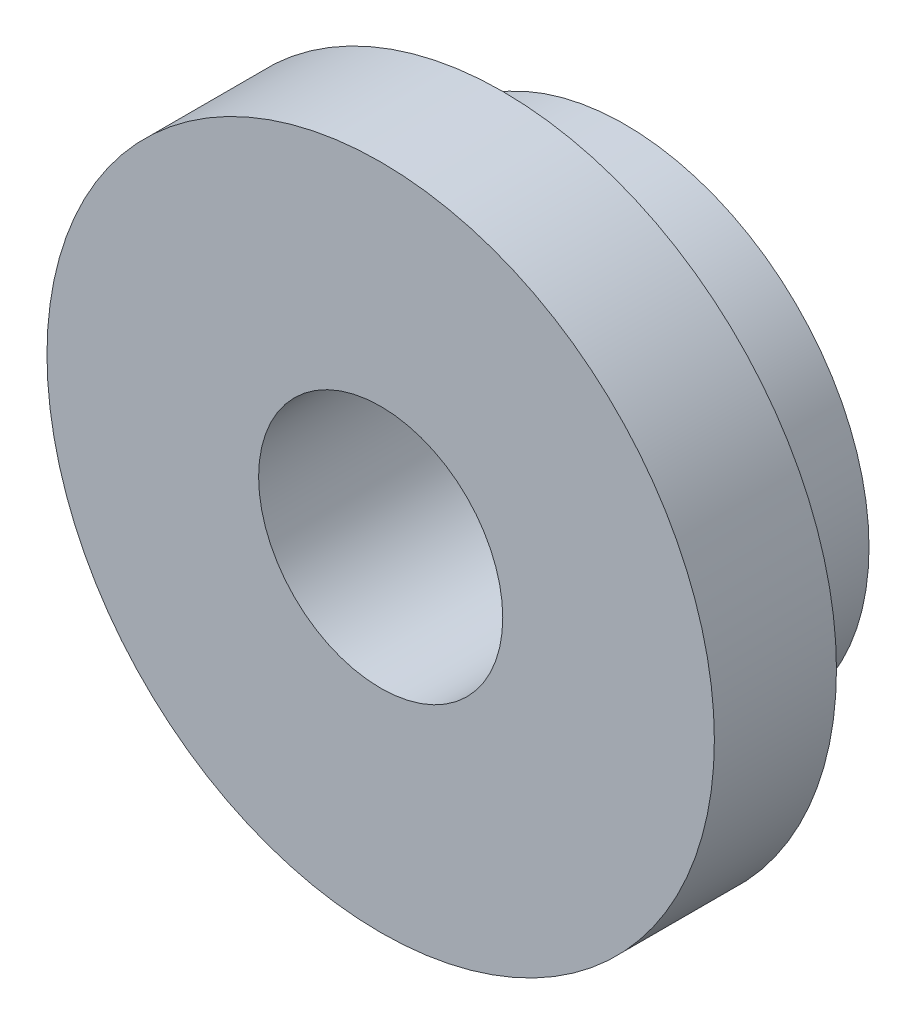
ISO-10303-21;
HEADER;
FILE_DESCRIPTION(('STEP AP214'),'2;1');
FILE_NAME('part.step','',(''),(''),'','','');
FILE_SCHEMA(('AUTOMOTIVE_DESIGN { 1 0 10303 214 1 1 1 1 }'));
ENDSEC;
DATA;
#1=APPLICATION_CONTEXT('core data for automotive mechanical design processes');
#2=APPLICATION_PROTOCOL_DEFINITION('international standard','automotive_design',2000,#1);
#3=PRODUCT_CONTEXT('',#1,'mechanical');
#4=PRODUCT('Part','Part','',(#3));
#5=PRODUCT_RELATED_PRODUCT_CATEGORY('part','',(#4));
#6=PRODUCT_DEFINITION_FORMATION('','',#4);
#7=PRODUCT_DEFINITION_CONTEXT('part definition',#1,'design');
#8=PRODUCT_DEFINITION('design','',#6,#7);
#9=PRODUCT_DEFINITION_SHAPE('','',#8);
#10=(LENGTH_UNIT() NAMED_UNIT(*) SI_UNIT(.MILLI.,.METRE.));
#11=(NAMED_UNIT(*) PLANE_ANGLE_UNIT() SI_UNIT($,.RADIAN.));
#12=(NAMED_UNIT(*) SI_UNIT($,.STERADIAN.) SOLID_ANGLE_UNIT());
#13=UNCERTAINTY_MEASURE_WITH_UNIT(LENGTH_MEASURE(1.E-05),#10,'distance_accuracy_value','');
#14=(GEOMETRIC_REPRESENTATION_CONTEXT(3) GLOBAL_UNCERTAINTY_ASSIGNED_CONTEXT((#13)) GLOBAL_UNIT_ASSIGNED_CONTEXT((#10,
#11,#12)) REPRESENTATION_CONTEXT('',''));
#15=CARTESIAN_POINT('',(0.,0.,0.));
#16=DIRECTION('',(0.,0.,1.));
#17=DIRECTION('',(1.,0.,0.));
#18=AXIS2_PLACEMENT_3D('',#15,#16,#17);
#19=CARTESIAN_POINT('',(0.,0.,0.));
#20=DIRECTION('',(0.,0.,1.));
#21=DIRECTION('',(1.,0.,0.));
#22=AXIS2_PLACEMENT_3D('',#19,#20,#21);
#23=PLANE('',#22);
#24=CARTESIAN_POINT('',(0.,0.,0.));
#25=DIRECTION('',(0.,0.,1.));
#26=DIRECTION('',(1.,0.,0.));
#27=AXIS2_PLACEMENT_3D('',#24,#25,#26);
#28=CIRCLE('',#27,6.35);
#29=CARTESIAN_POINT('',(6.35,0.,0.));
#30=VERTEX_POINT('',#29);
#31=EDGE_CURVE('E41',#30,#30,#28,.T.);
#32=ORIENTED_EDGE('',*,*,#31,.F.);
#33=EDGE_LOOP('',(#32));
#34=FACE_BOUND('',#33,.T.);
#35=CARTESIAN_POINT('',(0.,0.,0.));
#36=DIRECTION('',(0.,0.,1.));
#37=DIRECTION('',(1.,0.,0.));
#38=AXIS2_PLACEMENT_3D('',#35,#36,#37);
#39=CIRCLE('',#38,3.175);
#40=CARTESIAN_POINT('',(3.175,0.,0.));
#41=VERTEX_POINT('',#40);
#42=EDGE_CURVE('E50',#41,#41,#39,.T.);
#43=ORIENTED_EDGE('',*,*,#42,.T.);
#44=EDGE_LOOP('',(#43));
#45=FACE_BOUND('',#44,.T.);
#46=ADVANCED_FACE('F37',(#34,#45),#23,.F.);
#47=CARTESIAN_POINT('',(0.,0.,3.175));
#48=DIRECTION('',(0.,0.,-1.));
#49=DIRECTION('',(-1.,0.,0.));
#50=AXIS2_PLACEMENT_3D('',#47,#48,#49);
#51=CYLINDRICAL_SURFACE('',#50,6.35);
#52=CARTESIAN_POINT('',(0.,0.,3.175));
#53=DIRECTION('',(0.,0.,1.));
#54=DIRECTION('',(1.,0.,0.));
#55=AXIS2_PLACEMENT_3D('',#52,#53,#54);
#56=CIRCLE('',#55,6.35);
#57=CARTESIAN_POINT('',(6.35,0.,3.175));
#58=VERTEX_POINT('',#57);
#59=EDGE_CURVE('E10',#58,#58,#56,.T.);
#60=ORIENTED_EDGE('',*,*,#59,.F.);
#61=EDGE_LOOP('',(#60));
#62=FACE_BOUND('',#61,.T.);
#63=ORIENTED_EDGE('',*,*,#31,.T.);
#64=EDGE_LOOP('',(#63));
#65=FACE_BOUND('',#64,.T.);
#66=ADVANCED_FACE('F39',(#62,#65),#51,.T.);
#67=CARTESIAN_POINT('',(0.,0.,3.175));
#68=DIRECTION('',(0.,0.,-1.));
#69=DIRECTION('',(-1.,0.,0.));
#70=AXIS2_PLACEMENT_3D('',#67,#68,#69);
#71=CYLINDRICAL_SURFACE('',#70,3.175);
#72=ORIENTED_EDGE('',*,*,#42,.F.);
#73=EDGE_LOOP('',(#72));
#74=FACE_BOUND('',#73,.T.);
#75=CARTESIAN_POINT('',(0.,0.,6.35));
#76=DIRECTION('',(0.,0.,1.));
#77=DIRECTION('',(1.,0.,0.));
#78=AXIS2_PLACEMENT_3D('',#75,#76,#77);
#79=CIRCLE('',#78,3.175);
#80=CARTESIAN_POINT('',(3.175,0.,6.35));
#81=VERTEX_POINT('',#80);
#82=EDGE_CURVE('E60',#81,#81,#79,.T.);
#83=ORIENTED_EDGE('',*,*,#82,.T.);
#84=EDGE_LOOP('',(#83));
#85=FACE_BOUND('',#84,.T.);
#86=ADVANCED_FACE('F68',(#74,#85),#71,.F.);
#87=CARTESIAN_POINT('',(0.,0.,6.35));
#88=DIRECTION('',(0.,0.,1.));
#89=DIRECTION('',(1.,0.,0.));
#90=AXIS2_PLACEMENT_3D('',#87,#88,#89);
#91=PLANE('',#90);
#92=CARTESIAN_POINT('',(0.,0.,6.35));
#93=DIRECTION('',(0.,0.,1.));
#94=DIRECTION('',(1.,0.,0.));
#95=AXIS2_PLACEMENT_3D('',#92,#93,#94);
#96=CIRCLE('',#95,8.67833153876995);
#97=CARTESIAN_POINT('',(8.67833153876995,0.,6.35));
#98=VERTEX_POINT('',#97);
#99=EDGE_CURVE('E55',#98,#98,#96,.T.);
#100=ORIENTED_EDGE('',*,*,#99,.T.);
#101=EDGE_LOOP('',(#100));
#102=FACE_BOUND('',#101,.T.);
#103=ORIENTED_EDGE('',*,*,#82,.F.);
#104=EDGE_LOOP('',(#103));
#105=FACE_BOUND('',#104,.T.);
#106=ADVANCED_FACE('F70',(#102,#105),#91,.T.);
#107=CARTESIAN_POINT('',(0.,0.,3.175));
#108=DIRECTION('',(0.,0.,1.));
#109=DIRECTION('',(1.,0.,0.));
#110=AXIS2_PLACEMENT_3D('',#107,#108,#109);
#111=PLANE('',#110);
#112=ORIENTED_EDGE('',*,*,#59,.T.);
#113=EDGE_LOOP('',(#112));
#114=FACE_BOUND('',#113,.T.);
#115=CARTESIAN_POINT('',(0.,0.,3.175));
#116=DIRECTION('',(0.,0.,1.));
#117=DIRECTION('',(1.,0.,0.));
#118=AXIS2_PLACEMENT_3D('',#115,#116,#117);
#119=CIRCLE('',#118,8.67833153876995);
#120=CARTESIAN_POINT('',(8.67833153876995,0.,3.175));
#121=VERTEX_POINT('',#120);
#122=EDGE_CURVE('E56',#121,#121,#119,.T.);
#123=ORIENTED_EDGE('',*,*,#122,.F.);
#124=EDGE_LOOP('',(#123));
#125=FACE_BOUND('',#124,.T.);
#126=ADVANCED_FACE('F72',(#114,#125),#111,.F.);
#127=CARTESIAN_POINT('',(0.,0.,6.35));
#128=DIRECTION('',(0.,0.,-1.));
#129=DIRECTION('',(-1.,0.,0.));
#130=AXIS2_PLACEMENT_3D('',#127,#128,#129);
#131=CYLINDRICAL_SURFACE('',#130,8.67833153876995);
#132=ORIENTED_EDGE('',*,*,#99,.F.);
#133=EDGE_LOOP('',(#132));
#134=FACE_BOUND('',#133,.T.);
#135=ORIENTED_EDGE('',*,*,#122,.T.);
#136=EDGE_LOOP('',(#135));
#137=FACE_BOUND('',#136,.T.);
#138=ADVANCED_FACE('F79',(#134,#137),#131,.T.);
#139=CLOSED_SHELL('',(#46,#66,#86,#106,#126,#138));
#140=MANIFOLD_SOLID_BREP('B2',#139);
#141=ADVANCED_BREP_SHAPE_REPRESENTATION('',(#18,#140),#14);
#142=SHAPE_DEFINITION_REPRESENTATION(#9,#141);
ENDSEC;
END-ISO-10303-21;
